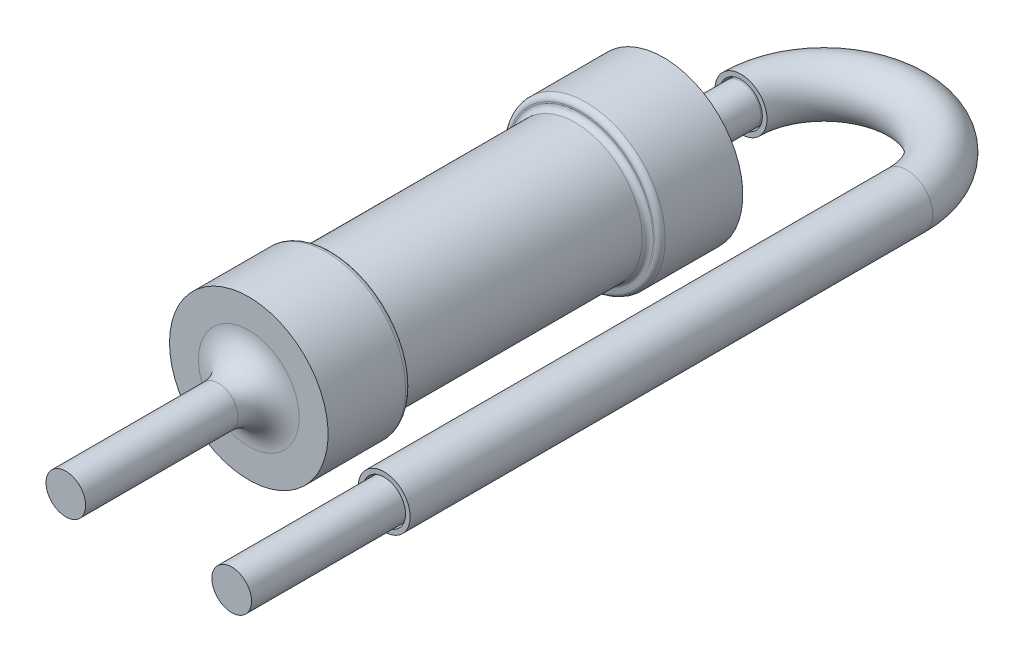
ISO-10303-21;
HEADER;
FILE_DESCRIPTION(('STEP AP214'),'2;1');
FILE_NAME('part.step','',(''),(''),'','','');
FILE_SCHEMA(('AUTOMOTIVE_DESIGN { 1 0 10303 214 1 1 1 1 }'));
ENDSEC;
DATA;
#1=APPLICATION_CONTEXT('core data for automotive mechanical design processes');
#2=APPLICATION_PROTOCOL_DEFINITION('international standard','automotive_design',2000,#1);
#3=PRODUCT_CONTEXT('',#1,'mechanical');
#4=PRODUCT('Part','Part','',(#3));
#5=PRODUCT_RELATED_PRODUCT_CATEGORY('part','',(#4));
#6=PRODUCT_DEFINITION_FORMATION('','',#4);
#7=PRODUCT_DEFINITION_CONTEXT('part definition',#1,'design');
#8=PRODUCT_DEFINITION('design','',#6,#7);
#9=PRODUCT_DEFINITION_SHAPE('','',#8);
#10=(LENGTH_UNIT() NAMED_UNIT(*) SI_UNIT(.MILLI.,.METRE.));
#11=(NAMED_UNIT(*) PLANE_ANGLE_UNIT() SI_UNIT($,.RADIAN.));
#12=(NAMED_UNIT(*) SI_UNIT($,.STERADIAN.) SOLID_ANGLE_UNIT());
#13=UNCERTAINTY_MEASURE_WITH_UNIT(LENGTH_MEASURE(1.E-05),#10,'distance_accuracy_value','');
#14=(GEOMETRIC_REPRESENTATION_CONTEXT(3) GLOBAL_UNCERTAINTY_ASSIGNED_CONTEXT((#13)) GLOBAL_UNIT_ASSIGNED_CONTEXT((#10,
#11,#12)) REPRESENTATION_CONTEXT('',''));
#15=CARTESIAN_POINT('',(0.,0.,0.));
#16=DIRECTION('',(0.,0.,1.));
#17=DIRECTION('',(1.,0.,0.));
#18=AXIS2_PLACEMENT_3D('',#15,#16,#17);
#19=CARTESIAN_POINT('',(2.719763935329,0.,6.4));
#20=DIRECTION('',(0.,0.,1.));
#21=DIRECTION('',(1.,0.,0.));
#22=AXIS2_PLACEMENT_3D('',#19,#20,#21);
#23=PLANE('',#22);
#24=CARTESIAN_POINT('',(2.719763935329,0.,6.4));
#25=DIRECTION('',(0.,0.,1.));
#26=DIRECTION('',(1.,0.,0.));
#27=AXIS2_PLACEMENT_3D('',#24,#25,#26);
#28=CIRCLE('',#27,0.325);
#29=CARTESIAN_POINT('',(3.044763935329,0.,6.4));
#30=VERTEX_POINT('',#29);
#31=EDGE_CURVE('P0_E206',#30,#30,#28,.F.);
#32=ORIENTED_EDGE('',*,*,#31,.F.);
#33=EDGE_LOOP('',(#32));
#34=FACE_BOUND('',#33,.T.);
#35=ADVANCED_FACE('P0_F17',(#34),#23,.T.);
#36=CARTESIAN_POINT('',(2.719763935329,0.,-4.67));
#37=DIRECTION('',(0.,0.,1.));
#38=DIRECTION('',(1.,0.,0.));
#39=AXIS2_PLACEMENT_3D('',#36,#37,#38);
#40=CYLINDRICAL_SURFACE('',#39,0.325);
#41=ORIENTED_EDGE('',*,*,#31,.T.);
#42=EDGE_LOOP('',(#41));
#43=FACE_BOUND('',#42,.T.);
#44=CARTESIAN_POINT('',(2.719763935328,0.,-4.67));
#45=DIRECTION('',(0.,0.,1.));
#46=DIRECTION('',(1.,0.,0.));
#47=AXIS2_PLACEMENT_3D('',#44,#45,#46);
#48=CIRCLE('',#47,0.325);
#49=CARTESIAN_POINT('',(3.044763935328,0.,-4.67));
#50=VERTEX_POINT('',#49);
#51=EDGE_CURVE('P0_E205',#50,#50,#48,.F.);
#52=ORIENTED_EDGE('',*,*,#51,.F.);
#53=EDGE_LOOP('',(#52));
#54=FACE_BOUND('',#53,.T.);
#55=ADVANCED_FACE('P0_F479',(#43,#54),#40,.T.);
#56=CARTESIAN_POINT('',(0.,0.,6.4));
#57=DIRECTION('',(0.,0.,1.));
#58=DIRECTION('',(1.,0.,0.));
#59=AXIS2_PLACEMENT_3D('',#56,#57,#58);
#60=PLANE('',#59);
#61=CARTESIAN_POINT('',(0.,0.,6.4));
#62=DIRECTION('',(0.,0.,-1.));
#63=DIRECTION('',(-1.,0.,0.));
#64=AXIS2_PLACEMENT_3D('',#61,#62,#63);
#65=CIRCLE('',#64,0.325);
#66=CARTESIAN_POINT('',(-0.325,0.,6.4));
#67=VERTEX_POINT('',#66);
#68=EDGE_CURVE('P0_E201',#67,#67,#65,.T.);
#69=ORIENTED_EDGE('',*,*,#68,.F.);
#70=EDGE_LOOP('',(#69));
#71=FACE_BOUND('',#70,.T.);
#72=ADVANCED_FACE('P0_F469',(#71),#60,.T.);
#73=CARTESIAN_POINT('',(1.359881967664,0.,-4.67));
#74=DIRECTION('',(0.,-1.,0.));
#75=DIRECTION('',(0.,0.,-1.));
#76=AXIS2_PLACEMENT_3D('',#73,#74,#75);
#77=TOROIDAL_SURFACE('',#76,1.359881967664,0.325);
#78=ORIENTED_EDGE('',*,*,#51,.T.);
#79=EDGE_LOOP('',(#78));
#80=FACE_BOUND('',#79,.T.);
#81=CARTESIAN_POINT('',(0.,0.,-4.67));
#82=DIRECTION('',(0.,0.,1.));
#83=DIRECTION('',(1.,0.,0.));
#84=AXIS2_PLACEMENT_3D('',#81,#82,#83);
#85=CIRCLE('',#84,0.325);
#86=CARTESIAN_POINT('',(0.325,0.,-4.67));
#87=VERTEX_POINT('',#86);
#88=EDGE_CURVE('P0_E204',#87,#87,#85,.T.);
#89=ORIENTED_EDGE('',*,*,#88,.F.);
#90=EDGE_LOOP('',(#89));
#91=FACE_BOUND('',#90,.T.);
#92=ADVANCED_FACE('P0_F459',(#80,#91),#77,.T.);
#93=CARTESIAN_POINT('',(0.,0.,6.4));
#94=DIRECTION('',(0.,0.,-1.));
#95=DIRECTION('',(-1.,0.,0.));
#96=AXIS2_PLACEMENT_3D('',#93,#94,#95);
#97=CYLINDRICAL_SURFACE('',#96,0.325);
#98=CARTESIAN_POINT('',(0.,0.,3.9));
#99=DIRECTION('',(0.,0.,1.));
#100=DIRECTION('',(1.,0.,0.));
#101=AXIS2_PLACEMENT_3D('',#98,#99,#100);
#102=CIRCLE('',#101,0.325);
#103=CARTESIAN_POINT('',(0.325,0.,3.9));
#104=VERTEX_POINT('',#103);
#105=EDGE_CURVE('P0_E549',#104,#104,#102,.T.);
#106=ORIENTED_EDGE('',*,*,#105,.T.);
#107=EDGE_LOOP('',(#106));
#108=FACE_BOUND('',#107,.T.);
#109=ORIENTED_EDGE('',*,*,#68,.T.);
#110=EDGE_LOOP('',(#109));
#111=FACE_BOUND('',#110,.T.);
#112=ADVANCED_FACE('P0_F450',(#108,#111),#97,.T.);
#113=CARTESIAN_POINT('',(0.,0.,-4.67));
#114=DIRECTION('',(0.,0.,1.));
#115=DIRECTION('',(1.,0.,0.));
#116=AXIS2_PLACEMENT_3D('',#113,#114,#115);
#117=CYLINDRICAL_SURFACE('',#116,0.325);
#118=CARTESIAN_POINT('',(0.,0.,-3.9));
#119=DIRECTION('',(0.,0.,1.));
#120=DIRECTION('',(1.,0.,0.));
#121=AXIS2_PLACEMENT_3D('',#118,#119,#120);
#122=CIRCLE('',#121,0.325);
#123=CARTESIAN_POINT('',(0.325,0.,-3.9));
#124=VERTEX_POINT('',#123);
#125=EDGE_CURVE('P0_E76',#124,#124,#122,.F.);
#126=ORIENTED_EDGE('',*,*,#125,.T.);
#127=EDGE_LOOP('',(#126));
#128=FACE_BOUND('',#127,.T.);
#129=ORIENTED_EDGE('',*,*,#88,.T.);
#130=EDGE_LOOP('',(#129));
#131=FACE_BOUND('',#130,.T.);
#132=ADVANCED_FACE('P0_F440',(#128,#131),#117,.T.);
#133=CARTESIAN_POINT('',(0.,0.,3.9));
#134=DIRECTION('',(0.,0.,1.));
#135=DIRECTION('',(1.,0.,0.));
#136=AXIS2_PLACEMENT_3D('',#133,#134,#135);
#137=TOROIDAL_SURFACE('',#136,0.825,0.5);
#138=ORIENTED_EDGE('',*,*,#105,.F.);
#139=EDGE_LOOP('',(#138));
#140=FACE_BOUND('',#139,.T.);
#141=CARTESIAN_POINT('',(0.,0.,3.4));
#142=DIRECTION('',(0.,0.,1.));
#143=DIRECTION('',(-1.,0.,0.));
#144=AXIS2_PLACEMENT_3D('',#141,#142,#143);
#145=CIRCLE('',#144,0.825);
#146=CARTESIAN_POINT('',(0.825,0.,3.4));
#147=VERTEX_POINT('',#146);
#148=CARTESIAN_POINT('',(-0.825,0.,3.4));
#149=VERTEX_POINT('',#148);
#150=EDGE_CURVE('P0_E72',#147,#149,#145,.F.);
#151=ORIENTED_EDGE('',*,*,#150,.F.);
#152=CARTESIAN_POINT('',(0.,0.,3.4));
#153=DIRECTION('',(0.,0.,1.));
#154=DIRECTION('',(1.,0.,0.));
#155=AXIS2_PLACEMENT_3D('',#152,#153,#154);
#156=CIRCLE('',#155,0.825);
#157=EDGE_CURVE('P0_E69',#149,#147,#156,.F.);
#158=ORIENTED_EDGE('',*,*,#157,.F.);
#159=EDGE_LOOP('',(#151,#158));
#160=FACE_BOUND('',#159,.T.);
#161=ADVANCED_FACE('P0_F73',(#140,#160),#137,.F.);
#162=CARTESIAN_POINT('',(0.,0.,-3.9));
#163=DIRECTION('',(0.,0.,1.));
#164=DIRECTION('',(1.,0.,0.));
#165=AXIS2_PLACEMENT_3D('',#162,#163,#164);
#166=TOROIDAL_SURFACE('',#165,0.825,0.5);
#167=CARTESIAN_POINT('',(0.,0.,-3.4));
#168=DIRECTION('',(0.,0.,-1.));
#169=DIRECTION('',(-1.,0.,0.));
#170=AXIS2_PLACEMENT_3D('',#167,#168,#169);
#171=CIRCLE('',#170,0.825);
#172=CARTESIAN_POINT('',(-0.825,0.,-3.4));
#173=VERTEX_POINT('',#172);
#174=CARTESIAN_POINT('',(0.825,0.,-3.4));
#175=VERTEX_POINT('',#174);
#176=EDGE_CURVE('P0_E184',#173,#175,#171,.T.);
#177=ORIENTED_EDGE('',*,*,#176,.T.);
#178=CARTESIAN_POINT('',(0.,0.,-3.4));
#179=DIRECTION('',(0.,0.,-1.));
#180=DIRECTION('',(1.,0.,0.));
#181=AXIS2_PLACEMENT_3D('',#178,#179,#180);
#182=CIRCLE('',#181,0.825);
#183=EDGE_CURVE('P0_E80',#175,#173,#182,.T.);
#184=ORIENTED_EDGE('',*,*,#183,.T.);
#185=EDGE_LOOP('',(#177,#184));
#186=FACE_BOUND('',#185,.T.);
#187=ORIENTED_EDGE('',*,*,#125,.F.);
#188=EDGE_LOOP('',(#187));
#189=FACE_BOUND('',#188,.T.);
#190=ADVANCED_FACE('P0_F101',(#186,#189),#166,.F.);
#191=CARTESIAN_POINT('',(0.,0.,3.4));
#192=DIRECTION('',(0.,0.,1.));
#193=DIRECTION('',(1.,0.,0.));
#194=AXIS2_PLACEMENT_3D('',#191,#192,#193);
#195=PLANE('',#194);
#196=CARTESIAN_POINT('',(0.,0.,3.4));
#197=DIRECTION('',(0.,0.,-1.));
#198=DIRECTION('',(-1.,0.,0.));
#199=AXIS2_PLACEMENT_3D('',#196,#197,#198);
#200=CIRCLE('',#199,1.3);
#201=CARTESIAN_POINT('',(-1.3,0.,3.4));
#202=VERTEX_POINT('',#201);
#203=EDGE_CURVE('P0_E192',#202,#202,#200,.T.);
#204=ORIENTED_EDGE('',*,*,#203,.F.);
#205=EDGE_LOOP('',(#204));
#206=FACE_BOUND('',#205,.T.);
#207=ORIENTED_EDGE('',*,*,#150,.T.);
#208=ORIENTED_EDGE('',*,*,#157,.T.);
#209=EDGE_LOOP('',(#207,#208));
#210=FACE_BOUND('',#209,.T.);
#211=ADVANCED_FACE('P0_F79',(#206,#210),#195,.T.);
#212=CARTESIAN_POINT('',(0.,0.,-3.4));
#213=DIRECTION('',(0.,0.,1.));
#214=DIRECTION('',(1.,0.,0.));
#215=AXIS2_PLACEMENT_3D('',#212,#213,#214);
#216=PLANE('',#215);
#217=CARTESIAN_POINT('',(0.,0.,-3.4));
#218=DIRECTION('',(0.,0.,-1.));
#219=DIRECTION('',(-1.,0.,0.));
#220=AXIS2_PLACEMENT_3D('',#217,#218,#219);
#221=CIRCLE('',#220,1.3);
#222=CARTESIAN_POINT('',(-1.3,0.,-3.4));
#223=VERTEX_POINT('',#222);
#224=EDGE_CURVE('P0_E172',#223,#223,#221,.F.);
#225=ORIENTED_EDGE('',*,*,#224,.F.);
#226=EDGE_LOOP('',(#225));
#227=FACE_BOUND('',#226,.T.);
#228=ORIENTED_EDGE('',*,*,#183,.F.);
#229=ORIENTED_EDGE('',*,*,#176,.F.);
#230=EDGE_LOOP('',(#228,#229));
#231=FACE_BOUND('',#230,.T.);
#232=ADVANCED_FACE('P0_F100',(#227,#231),#216,.F.);
#233=CARTESIAN_POINT('',(0.,0.,3.4));
#234=DIRECTION('',(0.,0.,-1.));
#235=DIRECTION('',(-1.,0.,0.));
#236=AXIS2_PLACEMENT_3D('',#233,#234,#235);
#237=CYLINDRICAL_SURFACE('',#236,1.3);
#238=ORIENTED_EDGE('',*,*,#203,.T.);
#239=EDGE_LOOP('',(#238));
#240=FACE_BOUND('',#239,.T.);
#241=CARTESIAN_POINT('',(0.,0.,2.1289));
#242=DIRECTION('',(0.,0.,1.));
#243=DIRECTION('',(1.,0.,0.));
#244=AXIS2_PLACEMENT_3D('',#241,#242,#243);
#245=CIRCLE('',#244,1.3);
#246=CARTESIAN_POINT('',(1.3,0.,2.1289));
#247=VERTEX_POINT('',#246);
#248=EDGE_CURVE('P0_E169',#247,#247,#245,.F.);
#249=ORIENTED_EDGE('',*,*,#248,.F.);
#250=EDGE_LOOP('',(#249));
#251=FACE_BOUND('',#250,.T.);
#252=ADVANCED_FACE('P0_F356',(#240,#251),#237,.T.);
#253=CARTESIAN_POINT('',(0.,0.,-2.04));
#254=DIRECTION('',(0.,0.,-1.));
#255=DIRECTION('',(-1.,0.,0.));
#256=AXIS2_PLACEMENT_3D('',#253,#254,#255);
#257=CYLINDRICAL_SURFACE('',#256,1.3);
#258=CARTESIAN_POINT('',(0.,0.,-2.1289));
#259=DIRECTION('',(0.,0.,1.));
#260=DIRECTION('',(1.,0.,0.));
#261=AXIS2_PLACEMENT_3D('',#258,#259,#260);
#262=CIRCLE('',#261,1.3);
#263=CARTESIAN_POINT('',(1.3,0.,-2.1289));
#264=VERTEX_POINT('',#263);
#265=EDGE_CURVE('P0_E160',#264,#264,#262,.T.);
#266=ORIENTED_EDGE('',*,*,#265,.F.);
#267=EDGE_LOOP('',(#266));
#268=FACE_BOUND('',#267,.T.);
#269=ORIENTED_EDGE('',*,*,#224,.T.);
#270=EDGE_LOOP('',(#269));
#271=FACE_BOUND('',#270,.T.);
#272=ADVANCED_FACE('P0_F144',(#268,#271),#257,.T.);
#273=CARTESIAN_POINT('',(0.,0.,2.1289));
#274=DIRECTION('',(0.,0.,1.));
#275=DIRECTION('',(1.,0.,0.));
#276=AXIS2_PLACEMENT_3D('',#273,#274,#275);
#277=TOROIDAL_SURFACE('',#276,1.2111,0.0889);
#278=CARTESIAN_POINT('',(0.,0.,2.04));
#279=DIRECTION('',(0.,0.,1.));
#280=DIRECTION('',(1.,0.,0.));
#281=AXIS2_PLACEMENT_3D('',#278,#279,#280);
#282=CIRCLE('',#281,1.2111);
#283=CARTESIAN_POINT('',(1.2111,0.,2.04));
#284=VERTEX_POINT('',#283);
#285=CARTESIAN_POINT('',(-1.2111,0.,2.04));
#286=VERTEX_POINT('',#285);
#287=EDGE_CURVE('P0_E168',#284,#286,#282,.T.);
#288=ORIENTED_EDGE('',*,*,#287,.T.);
#289=CARTESIAN_POINT('',(0.,0.,2.04));
#290=DIRECTION('',(0.,0.,1.));
#291=DIRECTION('',(-1.,0.,0.));
#292=AXIS2_PLACEMENT_3D('',#289,#290,#291);
#293=CIRCLE('',#292,1.2111);
#294=EDGE_CURVE('P0_E155',#286,#284,#293,.T.);
#295=ORIENTED_EDGE('',*,*,#294,.T.);
#296=EDGE_LOOP('',(#288,#295));
#297=FACE_BOUND('',#296,.T.);
#298=ORIENTED_EDGE('',*,*,#248,.T.);
#299=EDGE_LOOP('',(#298));
#300=FACE_BOUND('',#299,.T.);
#301=ADVANCED_FACE('P0_F132',(#297,#300),#277,.T.);
#302=CARTESIAN_POINT('',(0.,0.,-2.1289));
#303=DIRECTION('',(0.,0.,1.));
#304=DIRECTION('',(1.,0.,0.));
#305=AXIS2_PLACEMENT_3D('',#302,#303,#304);
#306=TOROIDAL_SURFACE('',#305,1.2111,0.0889);
#307=ORIENTED_EDGE('',*,*,#265,.T.);
#308=EDGE_LOOP('',(#307));
#309=FACE_BOUND('',#308,.T.);
#310=CARTESIAN_POINT('',(0.,0.,-2.04));
#311=DIRECTION('',(0.,0.,-1.));
#312=DIRECTION('',(1.,0.,0.));
#313=AXIS2_PLACEMENT_3D('',#310,#311,#312);
#314=CIRCLE('',#313,1.2111);
#315=CARTESIAN_POINT('',(-1.2111,0.,-2.04));
#316=VERTEX_POINT('',#315);
#317=CARTESIAN_POINT('',(1.2111,0.,-2.04));
#318=VERTEX_POINT('',#317);
#319=EDGE_CURVE('P0_E255',#316,#318,#314,.F.);
#320=ORIENTED_EDGE('',*,*,#319,.F.);
#321=CARTESIAN_POINT('',(0.,0.,-2.04));
#322=DIRECTION('',(0.,0.,-1.));
#323=DIRECTION('',(-1.,0.,0.));
#324=AXIS2_PLACEMENT_3D('',#321,#322,#323);
#325=CIRCLE('',#324,1.2111);
#326=EDGE_CURVE('P0_E245',#318,#316,#325,.F.);
#327=ORIENTED_EDGE('',*,*,#326,.F.);
#328=EDGE_LOOP('',(#320,#327));
#329=FACE_BOUND('',#328,.T.);
#330=ADVANCED_FACE('P0_F143',(#309,#329),#306,.T.);
#331=CARTESIAN_POINT('',(0.,0.,2.04));
#332=DIRECTION('',(0.,0.,1.));
#333=DIRECTION('',(1.,0.,0.));
#334=AXIS2_PLACEMENT_3D('',#331,#332,#333);
#335=PLANE('',#334);
#336=CARTESIAN_POINT('',(0.,0.,2.04));
#337=DIRECTION('',(0.,0.,-1.));
#338=DIRECTION('',(1.,0.,0.));
#339=AXIS2_PLACEMENT_3D('',#336,#337,#338);
#340=CIRCLE('',#339,1.1889);
#341=CARTESIAN_POINT('',(-1.1889,0.,2.04));
#342=VERTEX_POINT('',#341);
#343=CARTESIAN_POINT('',(1.1889,0.,2.04));
#344=VERTEX_POINT('',#343);
#345=EDGE_CURVE('P0_E332',#342,#344,#340,.F.);
#346=ORIENTED_EDGE('',*,*,#345,.T.);
#347=CARTESIAN_POINT('',(0.,0.,2.04));
#348=DIRECTION('',(0.,0.,-1.));
#349=DIRECTION('',(-1.,0.,0.));
#350=AXIS2_PLACEMENT_3D('',#347,#348,#349);
#351=CIRCLE('',#350,1.1889);
#352=EDGE_CURVE('P0_E212',#344,#342,#351,.F.);
#353=ORIENTED_EDGE('',*,*,#352,.T.);
#354=EDGE_LOOP('',(#346,#353));
#355=FACE_BOUND('',#354,.T.);
#356=ORIENTED_EDGE('',*,*,#287,.F.);
#357=ORIENTED_EDGE('',*,*,#294,.F.);
#358=EDGE_LOOP('',(#356,#357));
#359=FACE_BOUND('',#358,.T.);
#360=ADVANCED_FACE('P0_F299',(#355,#359),#335,.F.);
#361=CARTESIAN_POINT('',(0.,0.,-2.04));
#362=DIRECTION('',(0.,0.,1.));
#363=DIRECTION('',(1.,0.,0.));
#364=AXIS2_PLACEMENT_3D('',#361,#362,#363);
#365=PLANE('',#364);
#366=CARTESIAN_POINT('',(0.,0.,-2.04));
#367=DIRECTION('',(0.,0.,1.));
#368=DIRECTION('',(-1.,0.,0.));
#369=AXIS2_PLACEMENT_3D('',#366,#367,#368);
#370=CIRCLE('',#369,1.1889);
#371=CARTESIAN_POINT('',(1.1889,0.,-2.04));
#372=VERTEX_POINT('',#371);
#373=CARTESIAN_POINT('',(-1.1889,0.,-2.04));
#374=VERTEX_POINT('',#373);
#375=EDGE_CURVE('P0_E266',#372,#374,#370,.F.);
#376=ORIENTED_EDGE('',*,*,#375,.T.);
#377=CARTESIAN_POINT('',(0.,0.,-2.04));
#378=DIRECTION('',(0.,0.,1.));
#379=DIRECTION('',(1.,0.,0.));
#380=AXIS2_PLACEMENT_3D('',#377,#378,#379);
#381=CIRCLE('',#380,1.1889);
#382=EDGE_CURVE('P0_E36',#374,#372,#381,.F.);
#383=ORIENTED_EDGE('',*,*,#382,.T.);
#384=EDGE_LOOP('',(#376,#383));
#385=FACE_BOUND('',#384,.T.);
#386=ORIENTED_EDGE('',*,*,#326,.T.);
#387=ORIENTED_EDGE('',*,*,#319,.T.);
#388=EDGE_LOOP('',(#386,#387));
#389=FACE_BOUND('',#388,.T.);
#390=ADVANCED_FACE('P0_F230',(#385,#389),#365,.T.);
#391=CARTESIAN_POINT('',(0.,0.,1.9511));
#392=DIRECTION('',(0.,0.,1.));
#393=DIRECTION('',(1.,0.,0.));
#394=AXIS2_PLACEMENT_3D('',#391,#392,#393);
#395=TOROIDAL_SURFACE('',#394,1.1889,0.0889);
#396=CARTESIAN_POINT('',(0.,0.,1.9511));
#397=DIRECTION('',(0.,0.,-1.));
#398=DIRECTION('',(-1.,0.,0.));
#399=AXIS2_PLACEMENT_3D('',#396,#397,#398);
#400=CIRCLE('',#399,1.1);
#401=CARTESIAN_POINT('',(-1.1,0.,1.9511));
#402=VERTEX_POINT('',#401);
#403=EDGE_CURVE('P0_E28',#402,#402,#400,.T.);
#404=ORIENTED_EDGE('',*,*,#403,.F.);
#405=EDGE_LOOP('',(#404));
#406=FACE_BOUND('',#405,.T.);
#407=ORIENTED_EDGE('',*,*,#345,.F.);
#408=ORIENTED_EDGE('',*,*,#352,.F.);
#409=EDGE_LOOP('',(#407,#408));
#410=FACE_BOUND('',#409,.T.);
#411=ADVANCED_FACE('P0_F218',(#406,#410),#395,.F.);
#412=CARTESIAN_POINT('',(0.,0.,-1.9511));
#413=DIRECTION('',(0.,0.,1.));
#414=DIRECTION('',(1.,0.,0.));
#415=AXIS2_PLACEMENT_3D('',#412,#413,#414);
#416=TOROIDAL_SURFACE('',#415,1.1889,0.0889);
#417=CARTESIAN_POINT('',(0.,0.,-1.9511));
#418=DIRECTION('',(0.,0.,-1.));
#419=DIRECTION('',(-1.,0.,0.));
#420=AXIS2_PLACEMENT_3D('',#417,#418,#419);
#421=CIRCLE('',#420,1.1);
#422=CARTESIAN_POINT('',(-1.1,0.,-1.9511));
#423=VERTEX_POINT('',#422);
#424=EDGE_CURVE('P0_E11',#423,#423,#421,.F.);
#425=ORIENTED_EDGE('',*,*,#424,.F.);
#426=EDGE_LOOP('',(#425));
#427=FACE_BOUND('',#426,.T.);
#428=ORIENTED_EDGE('',*,*,#375,.F.);
#429=ORIENTED_EDGE('',*,*,#382,.F.);
#430=EDGE_LOOP('',(#428,#429));
#431=FACE_BOUND('',#430,.T.);
#432=ADVANCED_FACE('P0_F229',(#427,#431),#416,.F.);
#433=CARTESIAN_POINT('',(0.,0.,2.04));
#434=DIRECTION('',(0.,0.,-1.));
#435=DIRECTION('',(-1.,0.,0.));
#436=AXIS2_PLACEMENT_3D('',#433,#434,#435);
#437=CYLINDRICAL_SURFACE('',#436,1.1);
#438=ORIENTED_EDGE('',*,*,#403,.T.);
#439=EDGE_LOOP('',(#438));
#440=FACE_BOUND('',#439,.T.);
#441=ORIENTED_EDGE('',*,*,#424,.T.);
#442=EDGE_LOOP('',(#441));
#443=FACE_BOUND('',#442,.T.);
#444=ADVANCED_FACE('P0_F365',(#440,#443),#437,.T.);
#445=CLOSED_SHELL('',(#35,#55,#72,#92,#112,#132,#161,#190,#211,#232,#252,#272,#301,#330,#360,
#390,#411,#432,#444));
#446=MANIFOLD_SOLID_BREP('P0_B1',#445);
#447=CARTESIAN_POINT('',(0.,0.,-4.67));
#448=DIRECTION('',(0.,0.,-1.));
#449=DIRECTION('',(-1.,0.,0.));
#450=AXIS2_PLACEMENT_3D('',#447,#448,#449);
#451=PLANE('',#450);
#452=CARTESIAN_POINT('',(0.4266,0.,-4.67));
#453=CARTESIAN_POINT('',(0.426598031584092,-0.0239485151233561,-4.67));
#454=CARTESIAN_POINT('',(0.424575945485865,-0.0479187592671274,-4.67));
#455=CARTESIAN_POINT('',(0.416531430656592,-0.0952197343087887,-4.67));
#456=CARTESIAN_POINT('',(0.410500440290582,-0.118548984984785,-4.67));
#457=CARTESIAN_POINT('',(0.394617792544191,-0.163824657967324,-4.67));
#458=CARTESIAN_POINT('',(0.384772954383071,-0.185773467563071,-4.67));
#459=CARTESIAN_POINT('',(0.361523811771379,-0.227737570147716,-4.67));
#460=CARTESIAN_POINT('',(0.348114457819629,-0.247750064858389,-4.67));
#461=CARTESIAN_POINT('',(0.318145479944651,-0.285211412686559,-4.67));
#462=CARTESIAN_POINT('',(0.301590324758815,-0.302663840907256,-4.67));
#463=CARTESIAN_POINT('',(0.265761453184487,-0.334566259752994,-4.67));
#464=CARTESIAN_POINT('',(0.246483963521603,-0.349012013059168,-4.67));
#465=CARTESIAN_POINT('',(0.205790992865716,-0.374450221009098,-4.67));
#466=CARTESIAN_POINT('',(0.184377079325643,-0.385445183231811,-4.67));
#467=CARTESIAN_POINT('',(0.140005994261552,-0.403684629645499,-4.67));
#468=CARTESIAN_POINT('',(0.117048732036258,-0.410928893193053,-4.67));
#469=CARTESIAN_POINT('',(0.0702445261836582,-0.421460123688957,-4.67));
#470=CARTESIAN_POINT('',(0.0463976087404644,-0.424747207009472,-4.67));
#471=CARTESIAN_POINT('',(-0.00150960855751429,-0.42727116570298,-4.67));
#472=CARTESIAN_POINT('',(-0.0255699084122992,-0.426508041075974,-4.67));
#473=CARTESIAN_POINT('',(-0.0732216002513999,-0.420953154387501,-4.67));
#474=CARTESIAN_POINT('',(-0.0968129784245907,-0.41616127384675,-4.67));
#475=CARTESIAN_POINT('',(-0.142854974939182,-0.402685178262604,-4.67));
#476=CARTESIAN_POINT('',(-0.165305660295203,-0.394001192171784,-4.67));
#477=CARTESIAN_POINT('',(-0.208446328114867,-0.37297970163048,-4.67));
#478=CARTESIAN_POINT('',(-0.22913501529164,-0.360639538779567,-4.67));
#479=CARTESIAN_POINT('',(-0.268117750892568,-0.332678517847442,-4.67));
#480=CARTESIAN_POINT('',(-0.286415106458013,-0.317062270111914,-4.67));
#481=CARTESIAN_POINT('',(-0.320154503573899,-0.282957354069072,-4.67));
#482=CARTESIAN_POINT('',(-0.335592476786385,-0.264464660888564,-4.67));
#483=CARTESIAN_POINT('',(-0.363122374827875,-0.225175817028559,-4.67));
#484=CARTESIAN_POINT('',(-0.375219027169904,-0.204382979722535,-4.67));
#485=CARTESIAN_POINT('',(-0.395771180345265,-0.161026849089928,-4.67));
#486=CARTESIAN_POINT('',(-0.404220150559006,-0.138460465147091,-4.67));
#487=CARTESIAN_POINT('',(-0.417190374588019,-0.0922666371233724,-4.67));
#488=CARTESIAN_POINT('',(-0.421719987104613,-0.0686415647006302,-4.67));
#489=CARTESIAN_POINT('',(-0.425812865042098,-0.0299364013297801,-4.67));
#490=CARTESIAN_POINT('',(-0.426601230640112,-0.0149724472374853,-4.67));
#491=CARTESIAN_POINT('',(-0.426598031584093,0.0239485151233562,-4.67));
#492=CARTESIAN_POINT('',(-0.424575945485866,0.0479187592671275,-4.67));
#493=CARTESIAN_POINT('',(-0.416531430656593,0.0952197343087887,-4.67));
#494=CARTESIAN_POINT('',(-0.410500440290583,0.118548984984785,-4.67));
#495=CARTESIAN_POINT('',(-0.394617792544192,0.163824657967324,-4.67));
#496=CARTESIAN_POINT('',(-0.384772954383072,0.185773467563071,-4.67));
#497=CARTESIAN_POINT('',(-0.36152381177138,0.227737570147716,-4.67));
#498=CARTESIAN_POINT('',(-0.34811445781963,0.247750064858389,-4.67));
#499=CARTESIAN_POINT('',(-0.318145479944652,0.285211412686559,-4.67));
#500=CARTESIAN_POINT('',(-0.301590324758816,0.302663840907255,-4.67));
#501=CARTESIAN_POINT('',(-0.265761453184487,0.334566259752994,-4.67));
#502=CARTESIAN_POINT('',(-0.246483963521604,0.349012013059168,-4.67));
#503=CARTESIAN_POINT('',(-0.205790992865717,0.374450221009098,-4.67));
#504=CARTESIAN_POINT('',(-0.184377079325644,0.385445183231811,-4.67));
#505=CARTESIAN_POINT('',(-0.140005994261552,0.4036846296455,-4.67));
#506=CARTESIAN_POINT('',(-0.117048732036258,0.410928893193053,-4.67));
#507=CARTESIAN_POINT('',(-0.0702445261836582,0.421460123688957,-4.67));
#508=CARTESIAN_POINT('',(-0.0463976087404644,0.424747207009472,-4.67));
#509=CARTESIAN_POINT('',(0.00150960855751429,0.42727116570298,-4.67));
#510=CARTESIAN_POINT('',(0.0255699084122992,0.426508041075974,-4.67));
#511=CARTESIAN_POINT('',(0.0732216002513999,0.420953154387501,-4.67));
#512=CARTESIAN_POINT('',(0.0968129784245907,0.41616127384675,-4.67));
#513=CARTESIAN_POINT('',(0.142854974939182,0.402685178262604,-4.67));
#514=CARTESIAN_POINT('',(0.165305660295203,0.394001192171784,-4.67));
#515=CARTESIAN_POINT('',(0.208446328114867,0.37297970163048,-4.67));
#516=CARTESIAN_POINT('',(0.229135015291639,0.360639538779566,-4.67));
#517=CARTESIAN_POINT('',(0.268117750892568,0.332678517847442,-4.67));
#518=CARTESIAN_POINT('',(0.286415106458012,0.317062270111914,-4.67));
#519=CARTESIAN_POINT('',(0.320154503573898,0.282957354069072,-4.67));
#520=CARTESIAN_POINT('',(0.335592476786384,0.264464660888564,-4.67));
#521=CARTESIAN_POINT('',(0.363122374827874,0.225175817028559,-4.67));
#522=CARTESIAN_POINT('',(0.375219027169903,0.204382979722535,-4.67));
#523=CARTESIAN_POINT('',(0.395771180345264,0.161026849089928,-4.67));
#524=CARTESIAN_POINT('',(0.404220150559005,0.13846046514709,-4.67));
#525=CARTESIAN_POINT('',(0.417190374588018,0.0922666371233725,-4.67));
#526=CARTESIAN_POINT('',(0.421719987104612,0.0686415647006303,-4.67));
#527=CARTESIAN_POINT('',(0.425812865042097,0.0299364013297802,-4.67));
#528=CARTESIAN_POINT('',(0.426601230640111,0.0149724472374854,-4.67));
#529=CARTESIAN_POINT('',(0.4266,0.,-4.67));
#530=B_SPLINE_CURVE_WITH_KNOTS('',3,(#452,#453,#454,#455,#456,#457,#458,#459,#460,#461,#462,
#463,#464,#465,#466,#467,#468,#469,#470,#471,#472,#473,#474,#475,#476,#477,#478,#479,#480,#481,
#482,#483,#484,#485,#486,#487,#488,#489,#490,#491,#492,#493,#494,#495,#496,#497,#498,#499,#500,
#501,#502,#503,#504,#505,#506,#507,#508,#509,#510,#511,#512,#513,#514,#515,#516,#517,#518,#519,
#520,#521,#522,#523,#524,#525,#526,#527,#528,#529),.UNSPECIFIED.,.T.,.F.,(4,2,2,2,2,2,2,2,2,2,2,
2,2,2,2,2,2,2,2,2,2,2,2,2,2,2,2,2,2,2,2,2,2,2,2,2,2,2,4),(0.,0.0717986134138313,
0.14375105864615,0.215575441197044,0.287502117620464,0.359327372972169,0.431253176607236,
0.503126592407231,0.575004235844902,0.646879765463958,0.718755295083014,0.790632938520686,
0.862506354320681,0.934432157955747,1.00625741330745,1.0781840897327,1.15000847228542,
1.22196091751957,1.29375953093523,1.33864753111085,1.41044614452468,1.482398589757,
1.5542229723079,1.62614964873132,1.69797490408302,1.76990070771809,1.84177412351808,
1.91365176695575,1.98552729657481,2.05740282619387,2.12928046963154,2.20115388543153,
2.2730796890666,2.3449049444183,2.41683162084355,2.48865600339627,2.56060844863043,
2.63240706204608,2.6772950622217),.UNSPECIFIED.);
#531=CARTESIAN_POINT('',(0.4266,0.,-4.67));
#532=VERTEX_POINT('',#531);
#533=EDGE_CURVE('P1_E39',#532,#532,#530,.T.);
#534=ORIENTED_EDGE('',*,*,#533,.F.);
#535=EDGE_LOOP('',(#534));
#536=FACE_BOUND('',#535,.T.);
#537=CARTESIAN_POINT('',(0.350399999999999,0.,-4.67));
#538=CARTESIAN_POINT('',(0.3503983831948,0.0196707916046172,-4.67));
#539=CARTESIAN_POINT('',(0.348737485494544,0.0393594309496766,-4.67));
#540=CARTESIAN_POINT('',(0.342129895190612,0.0782114273461737,-4.67));
#541=CARTESIAN_POINT('',(0.337176170245181,0.0973735685754837,-4.67));
#542=CARTESIAN_POINT('',(0.324130507638581,0.134562025635597,-4.67));
#543=CARTESIAN_POINT('',(0.316044171135671,0.15259030233427,-4.67));
#544=CARTESIAN_POINT('',(0.296947828067911,0.187058707543702,-4.67));
#545=CARTESIAN_POINT('',(0.285933673949956,0.20349653761001,-4.67));
#546=CARTESIAN_POINT('',(0.261317807980654,0.234266476295422,-4.67));
#547=CARTESIAN_POINT('',(0.24771976664525,0.248601521429353,-4.67));
#548=CARTESIAN_POINT('',(0.218290695116623,0.274805481084685,-4.67));
#549=CARTESIAN_POINT('',(0.202456565607339,0.286670915173384,-4.67));
#550=CARTESIAN_POINT('',(0.169043045427499,0.307558568873751,-4.67));
#551=CARTESIAN_POINT('',(0.151466078788918,0.316584666612582,-4.67));
#552=CARTESIAN_POINT('',(0.115022256248991,0.331570105005713,-4.67));
#553=CARTESIAN_POINT('',(0.0961536940130697,0.33752529650647,-4.67));
#554=CARTESIAN_POINT('',(0.0576973091298073,0.346178227692295,-4.67));
#555=CARTESIAN_POINT('',(0.0381099790101225,0.348878156592922,-4.67));
#556=CARTESIAN_POINT('',(-0.00123994791751829,0.350951280346702,-4.67));
#557=CARTESIAN_POINT('',(-0.0210025447254744,0.350324475199854,-4.67));
#558=CARTESIAN_POINT('',(-0.0601552623686423,0.345760326040307,-4.67));
#559=CARTESIAN_POINT('',(-0.0795451234389114,0.341820753178031,-4.67));
#560=CARTESIAN_POINT('',(-0.117361820734396,0.330747679042194,-4.67));
#561=CARTESIAN_POINT('',(-0.135789917867614,0.323618483249304,-4.67));
#562=CARTESIAN_POINT('',(-0.171213275146318,0.306357452949224,-4.67));
#563=CARTESIAN_POINT('',(-0.188206532180876,0.296221507073901,-4.67));
#564=CARTESIAN_POINT('',(-0.220226119640807,0.273254927625687,-4.67));
#565=CARTESIAN_POINT('',(-0.23525516651141,0.26042808088487,-4.67));
#566=CARTESIAN_POINT('',(-0.262967973090441,0.232415042212219,-4.67));
#567=CARTESIAN_POINT('',(-0.275648391162566,0.217225544335096,-4.67));
#568=CARTESIAN_POINT('',(-0.298260854044554,0.184954538792457,-4.67));
#569=CARTESIAN_POINT('',(-0.308196781933486,0.167875752659707,-4.67));
#570=CARTESIAN_POINT('',(-0.325077875153296,0.132263966083626,-4.67));
#571=CARTESIAN_POINT('',(-0.332017676375453,0.113728427074897,-4.67));
#572=CARTESIAN_POINT('',(-0.342671137528641,0.0757858172654132,-4.67));
#573=CARTESIAN_POINT('',(-0.346391663116137,0.0563806944932341,-4.67));
#574=CARTESIAN_POINT('',(-0.349753464388936,0.0245891116411973,-4.67));
#575=CARTESIAN_POINT('',(-0.350401010815511,0.0122980438621211,-4.67));
#576=CARTESIAN_POINT('',(-0.350398383194801,-0.0196707916046172,-4.67));
#577=CARTESIAN_POINT('',(-0.348737485494545,-0.0393594309496766,-4.67));
#578=CARTESIAN_POINT('',(-0.342129895190612,-0.0782114273461737,-4.67));
#579=CARTESIAN_POINT('',(-0.337176170245182,-0.0973735685754838,-4.67));
#580=CARTESIAN_POINT('',(-0.324130507638582,-0.134562025635597,-4.67));
#581=CARTESIAN_POINT('',(-0.316044171135672,-0.15259030233427,-4.67));
#582=CARTESIAN_POINT('',(-0.296947828067911,-0.187058707543701,-4.67));
#583=CARTESIAN_POINT('',(-0.285933673949957,-0.20349653761001,-4.67));
#584=CARTESIAN_POINT('',(-0.261317807980655,-0.234266476295422,-4.67));
#585=CARTESIAN_POINT('',(-0.247719766645251,-0.248601521429353,-4.67));
#586=CARTESIAN_POINT('',(-0.218290695116624,-0.274805481084685,-4.67));
#587=CARTESIAN_POINT('',(-0.20245656560734,-0.286670915173384,-4.67));
#588=CARTESIAN_POINT('',(-0.1690430454275,-0.307558568873751,-4.67));
#589=CARTESIAN_POINT('',(-0.15146607878892,-0.316584666612581,-4.67));
#590=CARTESIAN_POINT('',(-0.115022256248993,-0.331570105005713,-4.67));
#591=CARTESIAN_POINT('',(-0.0961536940130713,-0.337525296506469,-4.67));
#592=CARTESIAN_POINT('',(-0.057697309129809,-0.346178227692295,-4.67));
#593=CARTESIAN_POINT('',(-0.0381099790101243,-0.348878156592922,-4.67));
#594=CARTESIAN_POINT('',(0.00123994791751655,-0.350951280346702,-4.67));
#595=CARTESIAN_POINT('',(0.0210025447254726,-0.350324475199854,-4.67));
#596=CARTESIAN_POINT('',(0.0601552623686407,-0.345760326040307,-4.67));
#597=CARTESIAN_POINT('',(0.07954512343891,-0.341820753178031,-4.67));
#598=CARTESIAN_POINT('',(0.117361820734394,-0.330747679042194,-4.67));
#599=CARTESIAN_POINT('',(0.135789917867613,-0.323618483249305,-4.67));
#600=CARTESIAN_POINT('',(0.171213275146317,-0.306357452949224,-4.67));
#601=CARTESIAN_POINT('',(0.188206532180875,-0.2962215070739,-4.67));
#602=CARTESIAN_POINT('',(0.220226119640807,-0.273254927625687,-4.67));
#603=CARTESIAN_POINT('',(0.23525516651141,-0.26042808088487,-4.67));
#604=CARTESIAN_POINT('',(0.262967973090441,-0.232415042212218,-4.67));
#605=CARTESIAN_POINT('',(0.275648391162566,-0.217225544335095,-4.67));
#606=CARTESIAN_POINT('',(0.298260854044554,-0.184954538792457,-4.67));
#607=CARTESIAN_POINT('',(0.308196781933485,-0.167875752659707,-4.67));
#608=CARTESIAN_POINT('',(0.325077875153295,-0.132263966083625,-4.67));
#609=CARTESIAN_POINT('',(0.332017676375452,-0.113728427074896,-4.67));
#610=CARTESIAN_POINT('',(0.342671137528641,-0.075785817265413,-4.67));
#611=CARTESIAN_POINT('',(0.346391663116136,-0.056380694493234,-4.67));
#612=CARTESIAN_POINT('',(0.349753464388935,-0.0245891116411973,-4.67));
#613=CARTESIAN_POINT('',(0.35040101081551,-0.012298043862121,-4.67));
#614=CARTESIAN_POINT('',(0.350399999999999,0.,-4.67));
#615=B_SPLINE_CURVE_WITH_KNOTS('',3,(#537,#538,#539,#540,#541,#542,#543,#544,#545,#546,#547,
#548,#549,#550,#551,#552,#553,#554,#555,#556,#557,#558,#559,#560,#561,#562,#563,#564,#565,#566,
#567,#568,#569,#570,#571,#572,#573,#574,#575,#576,#577,#578,#579,#580,#581,#582,#583,#584,#585,
#586,#587,#588,#589,#590,#591,#592,#593,#594,#595,#596,#597,#598,#599,#600,#601,#602,#603,#604,
#605,#606,#607,#608,#609,#610,#611,#612,#613,#614),.UNSPECIFIED.,.T.,.F.,(4,2,2,2,2,2,2,2,2,2,2,
2,2,2,2,2,2,2,2,2,2,2,2,2,2,2,2,2,2,2,2,2,2,2,2,2,2,2,4),(0.,0.0589738259264099,
0.118074005976584,0.177068998114028,0.236148012222716,0.29514372125984,0.35422201847908,
0.413219269266567,0.472296024750571,0.531333027981976,0.59037003121338,0.649446786697384,
0.708444037484871,0.767522334704109,0.826518043741234,0.885597057851424,0.944592049990367,
1.00369223004205,1.06266605596995,1.09953608705654,1.15850991298295,1.21761009303313,
1.27660508517057,1.33568409927926,1.39467980831638,1.45375810553562,1.51275535632311,
1.57183211180711,1.63086911503852,1.68990611826992,1.74898287375393,1.80798012454141,
1.86705842176065,1.92605413079778,1.98513314490797,2.04412813704691,2.10322831709859,
2.1622021430265,2.19907217411309),.UNSPECIFIED.);
#616=CARTESIAN_POINT('',(0.350399999999999,0.,-4.67));
#617=VERTEX_POINT('',#616);
#618=EDGE_CURVE('P1_E19',#617,#617,#615,.T.);
#619=ORIENTED_EDGE('',*,*,#618,.F.);
#620=EDGE_LOOP('',(#619));
#621=FACE_BOUND('',#620,.T.);
#622=ADVANCED_FACE('P1_F15',(#536,#621),#451,.F.);
#623=CARTESIAN_POINT('',(1.359881967664,0.,-4.67));
#624=DIRECTION('',(0.,-1.,0.));
#625=DIRECTION('',(0.,0.,-1.));
#626=AXIS2_PLACEMENT_3D('',#623,#624,#625);
#627=TOROIDAL_SURFACE('',#626,1.359881967664,0.3504);
#628=ORIENTED_EDGE('',*,*,#618,.T.);
#629=EDGE_LOOP('',(#628));
#630=FACE_BOUND('',#629,.T.);
#631=CARTESIAN_POINT('',(2.719763935329,0.,-4.67));
#632=DIRECTION('',(0.,0.,1.));
#633=DIRECTION('',(1.,0.,0.));
#634=AXIS2_PLACEMENT_3D('',#631,#632,#633);
#635=CIRCLE('',#634,0.3504);
#636=CARTESIAN_POINT('',(3.070163935329,0.,-4.67));
#637=VERTEX_POINT('',#636);
#638=EDGE_CURVE('P1_E38',#637,#637,#635,.T.);
#639=ORIENTED_EDGE('',*,*,#638,.T.);
#640=EDGE_LOOP('',(#639));
#641=FACE_BOUND('',#640,.T.);
#642=ADVANCED_FACE('P1_F59',(#630,#641),#627,.F.);
#643=CARTESIAN_POINT('',(2.719763935329,0.,-4.67));
#644=DIRECTION('',(0.,0.,1.));
#645=DIRECTION('',(1.,0.,0.));
#646=AXIS2_PLACEMENT_3D('',#643,#644,#645);
#647=CYLINDRICAL_SURFACE('',#646,0.3504);
#648=ORIENTED_EDGE('',*,*,#638,.F.);
#649=EDGE_LOOP('',(#648));
#650=FACE_BOUND('',#649,.T.);
#651=CARTESIAN_POINT('',(2.719763935329,0.,3.9));
#652=DIRECTION('',(0.,0.,1.));
#653=DIRECTION('',(1.,0.,0.));
#654=AXIS2_PLACEMENT_3D('',#651,#652,#653);
#655=CIRCLE('',#654,0.3504);
#656=CARTESIAN_POINT('',(3.070163935329,0.,3.9));
#657=VERTEX_POINT('',#656);
#658=EDGE_CURVE('P1_E31',#657,#657,#655,.F.);
#659=ORIENTED_EDGE('',*,*,#658,.F.);
#660=EDGE_LOOP('',(#659));
#661=FACE_BOUND('',#660,.T.);
#662=ADVANCED_FACE('P1_F52',(#650,#661),#647,.F.);
#663=CARTESIAN_POINT('',(1.359881967664,0.,-4.67));
#664=DIRECTION('',(0.,-1.,0.));
#665=DIRECTION('',(0.,0.,-1.));
#666=AXIS2_PLACEMENT_3D('',#663,#664,#665);
#667=TOROIDAL_SURFACE('',#666,1.359881967664,0.4266);
#668=ORIENTED_EDGE('',*,*,#533,.T.);
#669=EDGE_LOOP('',(#668));
#670=FACE_BOUND('',#669,.T.);
#671=CARTESIAN_POINT('',(2.719763935329,0.,-4.67));
#672=DIRECTION('',(0.,0.,1.));
#673=DIRECTION('',(1.,0.,0.));
#674=AXIS2_PLACEMENT_3D('',#671,#672,#673);
#675=CIRCLE('',#674,0.4266);
#676=CARTESIAN_POINT('',(3.146363935329,0.,-4.67));
#677=VERTEX_POINT('',#676);
#678=EDGE_CURVE('P1_E26',#677,#677,#675,.T.);
#679=ORIENTED_EDGE('',*,*,#678,.F.);
#680=EDGE_LOOP('',(#679));
#681=FACE_BOUND('',#680,.T.);
#682=ADVANCED_FACE('P1_F45',(#670,#681),#667,.T.);
#683=CARTESIAN_POINT('',(2.719763935329,0.,3.9));
#684=DIRECTION('',(0.,0.,1.));
#685=DIRECTION('',(1.,0.,0.));
#686=AXIS2_PLACEMENT_3D('',#683,#684,#685);
#687=PLANE('',#686);
#688=CARTESIAN_POINT('',(2.719763935329,0.,3.9));
#689=DIRECTION('',(0.,0.,1.));
#690=DIRECTION('',(1.,0.,0.));
#691=AXIS2_PLACEMENT_3D('',#688,#689,#690);
#692=CIRCLE('',#691,0.4266);
#693=CARTESIAN_POINT('',(3.146363935329,0.,3.9));
#694=VERTEX_POINT('',#693);
#695=EDGE_CURVE('P1_E10',#694,#694,#692,.F.);
#696=ORIENTED_EDGE('',*,*,#695,.F.);
#697=EDGE_LOOP('',(#696));
#698=FACE_BOUND('',#697,.T.);
#699=ORIENTED_EDGE('',*,*,#658,.T.);
#700=EDGE_LOOP('',(#699));
#701=FACE_BOUND('',#700,.T.);
#702=ADVANCED_FACE('P1_F51',(#698,#701),#687,.T.);
#703=CARTESIAN_POINT('',(2.719763935329,0.,-4.67));
#704=DIRECTION('',(0.,0.,1.));
#705=DIRECTION('',(1.,0.,0.));
#706=AXIS2_PLACEMENT_3D('',#703,#704,#705);
#707=CYLINDRICAL_SURFACE('',#706,0.4266);
#708=ORIENTED_EDGE('',*,*,#695,.T.);
#709=EDGE_LOOP('',(#708));
#710=FACE_BOUND('',#709,.T.);
#711=ORIENTED_EDGE('',*,*,#678,.T.);
#712=EDGE_LOOP('',(#711));
#713=FACE_BOUND('',#712,.T.);
#714=ADVANCED_FACE('P1_F66',(#710,#713),#707,.T.);
#715=CLOSED_SHELL('',(#622,#642,#662,#682,#702,#714));
#716=MANIFOLD_SOLID_BREP('P1_B1',#715);
#717=ADVANCED_BREP_SHAPE_REPRESENTATION('',(#18,#446,#716),#14);
#718=SHAPE_DEFINITION_REPRESENTATION(#9,#717);
ENDSEC;
END-ISO-10303-21;
